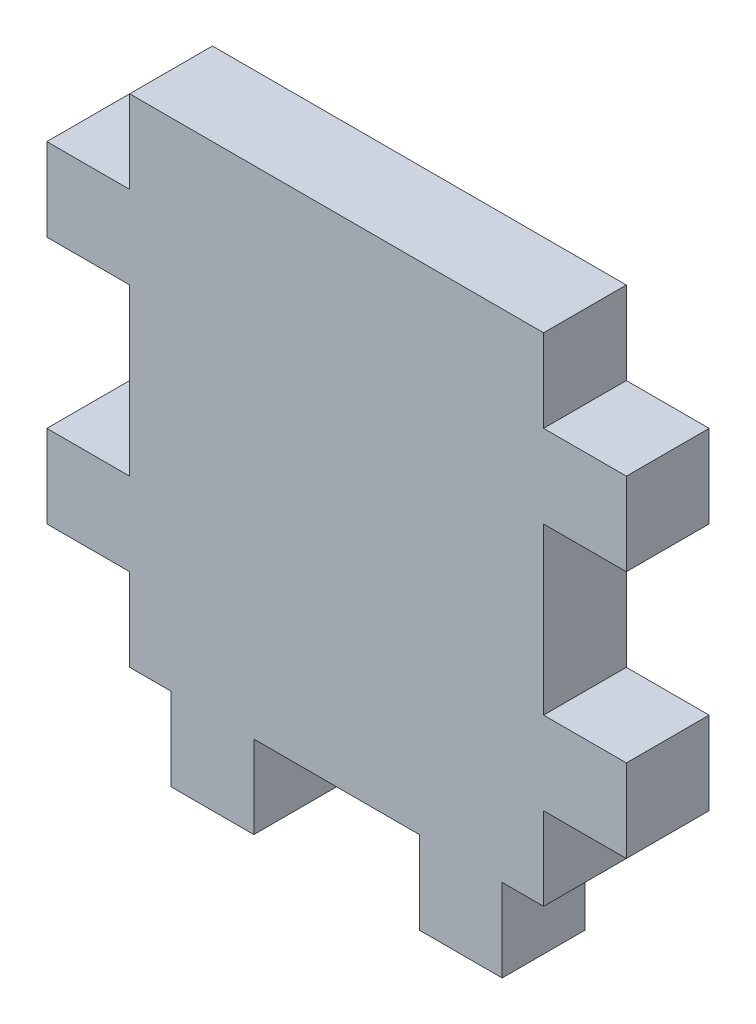
ISO-10303-21;
HEADER;
FILE_DESCRIPTION(('STEP AP214'),'2;1');
FILE_NAME('part.step','',(''),(''),'','','');
FILE_SCHEMA(('AUTOMOTIVE_DESIGN { 1 0 10303 214 1 1 1 1 }'));
ENDSEC;
DATA;
#1=APPLICATION_CONTEXT('core data for automotive mechanical design processes');
#2=APPLICATION_PROTOCOL_DEFINITION('international standard','automotive_design',2000,#1);
#3=PRODUCT_CONTEXT('',#1,'mechanical');
#4=PRODUCT('Part','Part','',(#3));
#5=PRODUCT_RELATED_PRODUCT_CATEGORY('part','',(#4));
#6=PRODUCT_DEFINITION_FORMATION('','',#4);
#7=PRODUCT_DEFINITION_CONTEXT('part definition',#1,'design');
#8=PRODUCT_DEFINITION('design','',#6,#7);
#9=PRODUCT_DEFINITION_SHAPE('','',#8);
#10=(LENGTH_UNIT() NAMED_UNIT(*) SI_UNIT(.MILLI.,.METRE.));
#11=(NAMED_UNIT(*) PLANE_ANGLE_UNIT() SI_UNIT($,.RADIAN.));
#12=(NAMED_UNIT(*) SI_UNIT($,.STERADIAN.) SOLID_ANGLE_UNIT());
#13=UNCERTAINTY_MEASURE_WITH_UNIT(LENGTH_MEASURE(1.E-05),#10,'distance_accuracy_value','');
#14=(GEOMETRIC_REPRESENTATION_CONTEXT(3) GLOBAL_UNCERTAINTY_ASSIGNED_CONTEXT((#13)) GLOBAL_UNIT_ASSIGNED_CONTEXT((#10,
#11,#12)) REPRESENTATION_CONTEXT('',''));
#15=CARTESIAN_POINT('',(0.,0.,0.));
#16=DIRECTION('',(0.,0.,1.));
#17=DIRECTION('',(1.,0.,0.));
#18=AXIS2_PLACEMENT_3D('',#15,#16,#17);
#19=CARTESIAN_POINT('',(5.,0.,5.));
#20=DIRECTION('',(0.,1.,0.));
#21=DIRECTION('',(-1.,0.,0.));
#22=AXIS2_PLACEMENT_3D('',#19,#20,#21);
#23=PLANE('',#22);
#24=DIRECTION('',(1.,0.,0.));
#25=VECTOR('',#24,1.);
#26=CARTESIAN_POINT('',(5.,0.,0.));
#27=LINE('',#26,#25);
#28=CARTESIAN_POINT('',(0.,0.,0.));
#29=VERTEX_POINT('',#28);
#30=CARTESIAN_POINT('',(5.,0.,0.));
#31=VERTEX_POINT('',#30);
#32=EDGE_CURVE('E252',#29,#31,#27,.T.);
#33=ORIENTED_EDGE('',*,*,#32,.T.);
#34=DIRECTION('',(0.,0.,-1.));
#35=VECTOR('',#34,1.);
#36=CARTESIAN_POINT('',(5.,0.,5.));
#37=LINE('',#36,#35);
#38=CARTESIAN_POINT('',(5.,0.,5.));
#39=VERTEX_POINT('',#38);
#40=EDGE_CURVE('E11',#39,#31,#37,.T.);
#41=ORIENTED_EDGE('',*,*,#40,.F.);
#42=DIRECTION('',(1.,0.,0.));
#43=VECTOR('',#42,1.);
#44=CARTESIAN_POINT('',(5.,0.,5.));
#45=LINE('',#44,#43);
#46=CARTESIAN_POINT('',(0.,0.,5.));
#47=VERTEX_POINT('',#46);
#48=EDGE_CURVE('E306',#47,#39,#45,.T.);
#49=ORIENTED_EDGE('',*,*,#48,.F.);
#50=DIRECTION('',(0.,0.,-1.));
#51=VECTOR('',#50,1.);
#52=CARTESIAN_POINT('',(0.,0.,5.));
#53=LINE('',#52,#51);
#54=EDGE_CURVE('E248',#47,#29,#53,.T.);
#55=ORIENTED_EDGE('',*,*,#54,.T.);
#56=EDGE_LOOP('',(#33,#41,#49,#55));
#57=FACE_BOUND('',#56,.T.);
#58=ADVANCED_FACE('F36',(#57),#23,.F.);
#59=CARTESIAN_POINT('',(5.,5.,5.));
#60=DIRECTION('',(-1.,0.,0.));
#61=DIRECTION('',(0.,-1.,0.));
#62=AXIS2_PLACEMENT_3D('',#59,#60,#61);
#63=PLANE('',#62);
#64=DIRECTION('',(0.,1.,0.));
#65=VECTOR('',#64,1.);
#66=CARTESIAN_POINT('',(5.,5.,0.));
#67=LINE('',#66,#65);
#68=CARTESIAN_POINT('',(5.,5.,0.));
#69=VERTEX_POINT('',#68);
#70=EDGE_CURVE('E255',#31,#69,#67,.T.);
#71=ORIENTED_EDGE('',*,*,#70,.T.);
#72=DIRECTION('',(0.,0.,-1.));
#73=VECTOR('',#72,1.);
#74=CARTESIAN_POINT('',(5.,5.,5.));
#75=LINE('',#74,#73);
#76=CARTESIAN_POINT('',(5.,5.,5.));
#77=VERTEX_POINT('',#76);
#78=EDGE_CURVE('E44',#77,#69,#75,.T.);
#79=ORIENTED_EDGE('',*,*,#78,.F.);
#80=DIRECTION('',(0.,1.,0.));
#81=VECTOR('',#80,1.);
#82=CARTESIAN_POINT('',(5.,5.,5.));
#83=LINE('',#82,#81);
#84=EDGE_CURVE('E155',#39,#77,#83,.T.);
#85=ORIENTED_EDGE('',*,*,#84,.F.);
#86=ORIENTED_EDGE('',*,*,#40,.T.);
#87=EDGE_LOOP('',(#71,#79,#85,#86));
#88=FACE_BOUND('',#87,.T.);
#89=ADVANCED_FACE('F464',(#88),#63,.F.);
#90=CARTESIAN_POINT('',(15.,5.,5.));
#91=DIRECTION('',(0.,1.,0.));
#92=DIRECTION('',(-1.,0.,0.));
#93=AXIS2_PLACEMENT_3D('',#90,#91,#92);
#94=PLANE('',#93);
#95=DIRECTION('',(1.,0.,0.));
#96=VECTOR('',#95,1.);
#97=CARTESIAN_POINT('',(15.,5.,0.));
#98=LINE('',#97,#96);
#99=CARTESIAN_POINT('',(15.,5.,0.));
#100=VERTEX_POINT('',#99);
#101=EDGE_CURVE('E257',#69,#100,#98,.T.);
#102=ORIENTED_EDGE('',*,*,#101,.T.);
#103=DIRECTION('',(0.,0.,-1.));
#104=VECTOR('',#103,1.);
#105=CARTESIAN_POINT('',(15.,5.,5.));
#106=LINE('',#105,#104);
#107=CARTESIAN_POINT('',(15.,5.,5.));
#108=VERTEX_POINT('',#107);
#109=EDGE_CURVE('E373',#108,#100,#106,.T.);
#110=ORIENTED_EDGE('',*,*,#109,.F.);
#111=DIRECTION('',(1.,0.,0.));
#112=VECTOR('',#111,1.);
#113=CARTESIAN_POINT('',(15.,5.,5.));
#114=LINE('',#113,#112);
#115=EDGE_CURVE('E381',#77,#108,#114,.T.);
#116=ORIENTED_EDGE('',*,*,#115,.F.);
#117=ORIENTED_EDGE('',*,*,#78,.T.);
#118=EDGE_LOOP('',(#102,#110,#116,#117));
#119=FACE_BOUND('',#118,.T.);
#120=ADVANCED_FACE('F379',(#119),#94,.F.);
#121=CARTESIAN_POINT('',(15.,0.,5.));
#122=DIRECTION('',(1.,0.,0.));
#123=DIRECTION('',(0.,0.,-1.));
#124=AXIS2_PLACEMENT_3D('',#121,#122,#123);
#125=PLANE('',#124);
#126=DIRECTION('',(0.,-1.,0.));
#127=VECTOR('',#126,1.);
#128=CARTESIAN_POINT('',(15.,0.,0.));
#129=LINE('',#128,#127);
#130=CARTESIAN_POINT('',(15.,0.,0.));
#131=VERTEX_POINT('',#130);
#132=EDGE_CURVE('E259',#100,#131,#129,.T.);
#133=ORIENTED_EDGE('',*,*,#132,.T.);
#134=DIRECTION('',(0.,0.,-1.));
#135=VECTOR('',#134,1.);
#136=CARTESIAN_POINT('',(15.,0.,5.));
#137=LINE('',#136,#135);
#138=CARTESIAN_POINT('',(15.,0.,5.));
#139=VERTEX_POINT('',#138);
#140=EDGE_CURVE('E370',#139,#131,#137,.T.);
#141=ORIENTED_EDGE('',*,*,#140,.F.);
#142=DIRECTION('',(0.,-1.,0.));
#143=VECTOR('',#142,1.);
#144=CARTESIAN_POINT('',(15.,0.,5.));
#145=LINE('',#144,#143);
#146=EDGE_CURVE('E399',#108,#139,#145,.T.);
#147=ORIENTED_EDGE('',*,*,#146,.F.);
#148=ORIENTED_EDGE('',*,*,#109,.T.);
#149=EDGE_LOOP('',(#133,#141,#147,#148));
#150=FACE_BOUND('',#149,.T.);
#151=ADVANCED_FACE('F390',(#150),#125,.F.);
#152=CARTESIAN_POINT('',(20.,0.,5.));
#153=DIRECTION('',(0.,1.,0.));
#154=DIRECTION('',(-1.,0.,0.));
#155=AXIS2_PLACEMENT_3D('',#152,#153,#154);
#156=PLANE('',#155);
#157=DIRECTION('',(1.,0.,0.));
#158=VECTOR('',#157,1.);
#159=CARTESIAN_POINT('',(20.,0.,0.));
#160=LINE('',#159,#158);
#161=CARTESIAN_POINT('',(20.,0.,0.));
#162=VERTEX_POINT('',#161);
#163=EDGE_CURVE('E261',#131,#162,#160,.T.);
#164=ORIENTED_EDGE('',*,*,#163,.T.);
#165=DIRECTION('',(0.,0.,-1.));
#166=VECTOR('',#165,1.);
#167=CARTESIAN_POINT('',(20.,0.,5.));
#168=LINE('',#167,#166);
#169=CARTESIAN_POINT('',(20.,0.,5.));
#170=VERTEX_POINT('',#169);
#171=EDGE_CURVE('E367',#170,#162,#168,.T.);
#172=ORIENTED_EDGE('',*,*,#171,.F.);
#173=DIRECTION('',(1.,0.,0.));
#174=VECTOR('',#173,1.);
#175=CARTESIAN_POINT('',(20.,0.,5.));
#176=LINE('',#175,#174);
#177=EDGE_CURVE('E396',#139,#170,#176,.T.);
#178=ORIENTED_EDGE('',*,*,#177,.F.);
#179=ORIENTED_EDGE('',*,*,#140,.T.);
#180=EDGE_LOOP('',(#164,#172,#178,#179));
#181=FACE_BOUND('',#180,.T.);
#182=ADVANCED_FACE('F394',(#181),#156,.F.);
#183=CARTESIAN_POINT('',(20.,5.,5.));
#184=DIRECTION('',(-1.,0.,0.));
#185=DIRECTION('',(0.,-1.,0.));
#186=AXIS2_PLACEMENT_3D('',#183,#184,#185);
#187=PLANE('',#186);
#188=DIRECTION('',(0.,1.,0.));
#189=VECTOR('',#188,1.);
#190=CARTESIAN_POINT('',(20.,5.,0.));
#191=LINE('',#190,#189);
#192=CARTESIAN_POINT('',(20.,5.,0.));
#193=VERTEX_POINT('',#192);
#194=EDGE_CURVE('E263',#162,#193,#191,.T.);
#195=ORIENTED_EDGE('',*,*,#194,.T.);
#196=DIRECTION('',(0.,0.,-1.));
#197=VECTOR('',#196,1.);
#198=CARTESIAN_POINT('',(20.,5.,5.));
#199=LINE('',#198,#197);
#200=CARTESIAN_POINT('',(20.,5.,5.));
#201=VERTEX_POINT('',#200);
#202=EDGE_CURVE('E364',#201,#193,#199,.T.);
#203=ORIENTED_EDGE('',*,*,#202,.F.);
#204=DIRECTION('',(0.,1.,0.));
#205=VECTOR('',#204,1.);
#206=CARTESIAN_POINT('',(20.,5.,5.));
#207=LINE('',#206,#205);
#208=EDGE_CURVE('E398',#170,#201,#207,.T.);
#209=ORIENTED_EDGE('',*,*,#208,.F.);
#210=ORIENTED_EDGE('',*,*,#171,.T.);
#211=EDGE_LOOP('',(#195,#203,#209,#210));
#212=FACE_BOUND('',#211,.T.);
#213=ADVANCED_FACE('F477',(#212),#187,.F.);
#214=CARTESIAN_POINT('',(22.5,5.,5.));
#215=DIRECTION('',(0.,1.,0.));
#216=DIRECTION('',(-1.,0.,0.));
#217=AXIS2_PLACEMENT_3D('',#214,#215,#216);
#218=PLANE('',#217);
#219=DIRECTION('',(1.,0.,0.));
#220=VECTOR('',#219,1.);
#221=CARTESIAN_POINT('',(22.5,5.,0.));
#222=LINE('',#221,#220);
#223=CARTESIAN_POINT('',(22.5,5.,0.));
#224=VERTEX_POINT('',#223);
#225=EDGE_CURVE('E265',#193,#224,#222,.T.);
#226=ORIENTED_EDGE('',*,*,#225,.T.);
#227=DIRECTION('',(0.,0.,-1.));
#228=VECTOR('',#227,1.);
#229=CARTESIAN_POINT('',(22.5,5.,5.));
#230=LINE('',#229,#228);
#231=CARTESIAN_POINT('',(22.5,5.,5.));
#232=VERTEX_POINT('',#231);
#233=EDGE_CURVE('E361',#232,#224,#230,.T.);
#234=ORIENTED_EDGE('',*,*,#233,.F.);
#235=DIRECTION('',(1.,0.,0.));
#236=VECTOR('',#235,1.);
#237=CARTESIAN_POINT('',(22.5,5.,5.));
#238=LINE('',#237,#236);
#239=EDGE_CURVE('E401',#201,#232,#238,.T.);
#240=ORIENTED_EDGE('',*,*,#239,.F.);
#241=ORIENTED_EDGE('',*,*,#202,.T.);
#242=EDGE_LOOP('',(#226,#234,#240,#241));
#243=FACE_BOUND('',#242,.T.);
#244=ADVANCED_FACE('F480',(#243),#218,.F.);
#245=CARTESIAN_POINT('',(22.5,10.0002749662121,5.));
#246=DIRECTION('',(-1.,0.,0.));
#247=DIRECTION('',(0.,-1.,0.));
#248=AXIS2_PLACEMENT_3D('',#245,#246,#247);
#249=PLANE('',#248);
#250=DIRECTION('',(0.,1.,0.));
#251=VECTOR('',#250,1.);
#252=CARTESIAN_POINT('',(22.5,10.0002749662121,0.));
#253=LINE('',#252,#251);
#254=CARTESIAN_POINT('',(22.5,10.0002749662121,0.));
#255=VERTEX_POINT('',#254);
#256=EDGE_CURVE('E267',#224,#255,#253,.T.);
#257=ORIENTED_EDGE('',*,*,#256,.T.);
#258=DIRECTION('',(0.,0.,-1.));
#259=VECTOR('',#258,1.);
#260=CARTESIAN_POINT('',(22.5,10.0002749662121,5.));
#261=LINE('',#260,#259);
#262=CARTESIAN_POINT('',(22.5,10.0002749662121,5.));
#263=VERTEX_POINT('',#262);
#264=EDGE_CURVE('E358',#263,#255,#261,.T.);
#265=ORIENTED_EDGE('',*,*,#264,.F.);
#266=DIRECTION('',(0.,1.,0.));
#267=VECTOR('',#266,1.);
#268=CARTESIAN_POINT('',(22.5,10.0002749662121,5.));
#269=LINE('',#268,#267);
#270=EDGE_CURVE('E407',#232,#263,#269,.T.);
#271=ORIENTED_EDGE('',*,*,#270,.F.);
#272=ORIENTED_EDGE('',*,*,#233,.T.);
#273=EDGE_LOOP('',(#257,#265,#271,#272));
#274=FACE_BOUND('',#273,.T.);
#275=ADVANCED_FACE('F484',(#274),#249,.F.);
#276=CARTESIAN_POINT('',(27.5,10.0002749662121,5.));
#277=DIRECTION('',(0.,1.,0.));
#278=DIRECTION('',(0.,0.,1.));
#279=AXIS2_PLACEMENT_3D('',#276,#277,#278);
#280=PLANE('',#279);
#281=DIRECTION('',(1.,0.,0.));
#282=VECTOR('',#281,1.);
#283=CARTESIAN_POINT('',(27.5,10.0002749662121,0.));
#284=LINE('',#283,#282);
#285=CARTESIAN_POINT('',(27.5,10.0002749662121,0.));
#286=VERTEX_POINT('',#285);
#287=EDGE_CURVE('E269',#255,#286,#284,.T.);
#288=ORIENTED_EDGE('',*,*,#287,.T.);
#289=DIRECTION('',(0.,0.,-1.));
#290=VECTOR('',#289,1.);
#291=CARTESIAN_POINT('',(27.5,10.0002749662121,5.));
#292=LINE('',#291,#290);
#293=CARTESIAN_POINT('',(27.5,10.0002749662121,5.));
#294=VERTEX_POINT('',#293);
#295=EDGE_CURVE('E355',#294,#286,#292,.T.);
#296=ORIENTED_EDGE('',*,*,#295,.F.);
#297=DIRECTION('',(1.,0.,0.));
#298=VECTOR('',#297,1.);
#299=CARTESIAN_POINT('',(27.5,10.0002749662121,5.));
#300=LINE('',#299,#298);
#301=EDGE_CURVE('E409',#263,#294,#300,.T.);
#302=ORIENTED_EDGE('',*,*,#301,.F.);
#303=ORIENTED_EDGE('',*,*,#264,.T.);
#304=EDGE_LOOP('',(#288,#296,#302,#303));
#305=FACE_BOUND('',#304,.T.);
#306=ADVANCED_FACE('F488',(#305),#280,.F.);
#307=CARTESIAN_POINT('',(27.5,15.0002749662121,5.));
#308=DIRECTION('',(-1.,0.,0.));
#309=DIRECTION('',(0.,-1.,0.));
#310=AXIS2_PLACEMENT_3D('',#307,#308,#309);
#311=PLANE('',#310);
#312=DIRECTION('',(0.,1.,0.));
#313=VECTOR('',#312,1.);
#314=CARTESIAN_POINT('',(27.5,15.0002749662121,0.));
#315=LINE('',#314,#313);
#316=CARTESIAN_POINT('',(27.5,15.0002749662121,0.));
#317=VERTEX_POINT('',#316);
#318=EDGE_CURVE('E271',#286,#317,#315,.T.);
#319=ORIENTED_EDGE('',*,*,#318,.T.);
#320=DIRECTION('',(0.,0.,-1.));
#321=VECTOR('',#320,1.);
#322=CARTESIAN_POINT('',(27.5,15.0002749662121,5.));
#323=LINE('',#322,#321);
#324=CARTESIAN_POINT('',(27.5,15.0002749662121,5.));
#325=VERTEX_POINT('',#324);
#326=EDGE_CURVE('E352',#325,#317,#323,.T.);
#327=ORIENTED_EDGE('',*,*,#326,.F.);
#328=DIRECTION('',(0.,1.,0.));
#329=VECTOR('',#328,1.);
#330=CARTESIAN_POINT('',(27.5,15.0002749662121,5.));
#331=LINE('',#330,#329);
#332=EDGE_CURVE('E411',#294,#325,#331,.T.);
#333=ORIENTED_EDGE('',*,*,#332,.F.);
#334=ORIENTED_EDGE('',*,*,#295,.T.);
#335=EDGE_LOOP('',(#319,#327,#333,#334));
#336=FACE_BOUND('',#335,.T.);
#337=ADVANCED_FACE('F492',(#336),#311,.F.);
#338=CARTESIAN_POINT('',(22.5,15.0002749662121,5.));
#339=DIRECTION('',(0.,-1.,0.));
#340=DIRECTION('',(0.,0.,-1.));
#341=AXIS2_PLACEMENT_3D('',#338,#339,#340);
#342=PLANE('',#341);
#343=DIRECTION('',(-1.,0.,0.));
#344=VECTOR('',#343,1.);
#345=CARTESIAN_POINT('',(22.5,15.0002749662121,0.));
#346=LINE('',#345,#344);
#347=CARTESIAN_POINT('',(22.5,15.0002749662121,0.));
#348=VERTEX_POINT('',#347);
#349=EDGE_CURVE('E273',#317,#348,#346,.T.);
#350=ORIENTED_EDGE('',*,*,#349,.T.);
#351=DIRECTION('',(0.,0.,-1.));
#352=VECTOR('',#351,1.);
#353=CARTESIAN_POINT('',(22.5,15.0002749662121,5.));
#354=LINE('',#353,#352);
#355=CARTESIAN_POINT('',(22.5,15.0002749662121,5.));
#356=VERTEX_POINT('',#355);
#357=EDGE_CURVE('E349',#356,#348,#354,.T.);
#358=ORIENTED_EDGE('',*,*,#357,.F.);
#359=DIRECTION('',(-1.,0.,0.));
#360=VECTOR('',#359,1.);
#361=CARTESIAN_POINT('',(22.5,15.0002749662121,5.));
#362=LINE('',#361,#360);
#363=EDGE_CURVE('E413',#325,#356,#362,.T.);
#364=ORIENTED_EDGE('',*,*,#363,.F.);
#365=ORIENTED_EDGE('',*,*,#326,.T.);
#366=EDGE_LOOP('',(#350,#358,#364,#365));
#367=FACE_BOUND('',#366,.T.);
#368=ADVANCED_FACE('F496',(#367),#342,.F.);
#369=CARTESIAN_POINT('',(22.5,25.0002749662121,5.));
#370=DIRECTION('',(-1.,0.,0.));
#371=DIRECTION('',(0.,-1.,0.));
#372=AXIS2_PLACEMENT_3D('',#369,#370,#371);
#373=PLANE('',#372);
#374=DIRECTION('',(0.,1.,0.));
#375=VECTOR('',#374,1.);
#376=CARTESIAN_POINT('',(22.5,25.0002749662121,0.));
#377=LINE('',#376,#375);
#378=CARTESIAN_POINT('',(22.5,25.0002749662121,0.));
#379=VERTEX_POINT('',#378);
#380=EDGE_CURVE('E275',#348,#379,#377,.T.);
#381=ORIENTED_EDGE('',*,*,#380,.T.);
#382=DIRECTION('',(0.,0.,-1.));
#383=VECTOR('',#382,1.);
#384=CARTESIAN_POINT('',(22.5,25.0002749662121,5.));
#385=LINE('',#384,#383);
#386=CARTESIAN_POINT('',(22.5,25.0002749662121,5.));
#387=VERTEX_POINT('',#386);
#388=EDGE_CURVE('E346',#387,#379,#385,.T.);
#389=ORIENTED_EDGE('',*,*,#388,.F.);
#390=DIRECTION('',(0.,1.,0.));
#391=VECTOR('',#390,1.);
#392=CARTESIAN_POINT('',(22.5,25.0002749662121,5.));
#393=LINE('',#392,#391);
#394=EDGE_CURVE('E415',#356,#387,#393,.T.);
#395=ORIENTED_EDGE('',*,*,#394,.F.);
#396=ORIENTED_EDGE('',*,*,#357,.T.);
#397=EDGE_LOOP('',(#381,#389,#395,#396));
#398=FACE_BOUND('',#397,.T.);
#399=ADVANCED_FACE('F500',(#398),#373,.F.);
#400=CARTESIAN_POINT('',(27.5,25.0002749662121,5.));
#401=DIRECTION('',(0.,1.,0.));
#402=DIRECTION('',(0.,0.,1.));
#403=AXIS2_PLACEMENT_3D('',#400,#401,#402);
#404=PLANE('',#403);
#405=DIRECTION('',(1.,0.,0.));
#406=VECTOR('',#405,1.);
#407=CARTESIAN_POINT('',(27.5,25.0002749662121,0.));
#408=LINE('',#407,#406);
#409=CARTESIAN_POINT('',(27.5,25.0002749662121,0.));
#410=VERTEX_POINT('',#409);
#411=EDGE_CURVE('E277',#379,#410,#408,.T.);
#412=ORIENTED_EDGE('',*,*,#411,.T.);
#413=DIRECTION('',(0.,0.,-1.));
#414=VECTOR('',#413,1.);
#415=CARTESIAN_POINT('',(27.5,25.0002749662121,5.));
#416=LINE('',#415,#414);
#417=CARTESIAN_POINT('',(27.5,25.0002749662121,5.));
#418=VERTEX_POINT('',#417);
#419=EDGE_CURVE('E343',#418,#410,#416,.T.);
#420=ORIENTED_EDGE('',*,*,#419,.F.);
#421=DIRECTION('',(1.,0.,0.));
#422=VECTOR('',#421,1.);
#423=CARTESIAN_POINT('',(27.5,25.0002749662121,5.));
#424=LINE('',#423,#422);
#425=EDGE_CURVE('E417',#387,#418,#424,.T.);
#426=ORIENTED_EDGE('',*,*,#425,.F.);
#427=ORIENTED_EDGE('',*,*,#388,.T.);
#428=EDGE_LOOP('',(#412,#420,#426,#427));
#429=FACE_BOUND('',#428,.T.);
#430=ADVANCED_FACE('F504',(#429),#404,.F.);
#431=CARTESIAN_POINT('',(27.5,30.0002749662121,5.));
#432=DIRECTION('',(-1.,0.,0.));
#433=DIRECTION('',(0.,0.,1.));
#434=AXIS2_PLACEMENT_3D('',#431,#432,#433);
#435=PLANE('',#434);
#436=DIRECTION('',(0.,1.,0.));
#437=VECTOR('',#436,1.);
#438=CARTESIAN_POINT('',(27.5,30.0002749662121,0.));
#439=LINE('',#438,#437);
#440=CARTESIAN_POINT('',(27.5,30.0002749662121,0.));
#441=VERTEX_POINT('',#440);
#442=EDGE_CURVE('E279',#410,#441,#439,.T.);
#443=ORIENTED_EDGE('',*,*,#442,.T.);
#444=DIRECTION('',(0.,0.,-1.));
#445=VECTOR('',#444,1.);
#446=CARTESIAN_POINT('',(27.5,30.0002749662121,5.));
#447=LINE('',#446,#445);
#448=CARTESIAN_POINT('',(27.5,30.0002749662121,5.));
#449=VERTEX_POINT('',#448);
#450=EDGE_CURVE('E340',#449,#441,#447,.T.);
#451=ORIENTED_EDGE('',*,*,#450,.F.);
#452=DIRECTION('',(0.,1.,0.));
#453=VECTOR('',#452,1.);
#454=CARTESIAN_POINT('',(27.5,30.0002749662121,5.));
#455=LINE('',#454,#453);
#456=EDGE_CURVE('E419',#418,#449,#455,.T.);
#457=ORIENTED_EDGE('',*,*,#456,.F.);
#458=ORIENTED_EDGE('',*,*,#419,.T.);
#459=EDGE_LOOP('',(#443,#451,#457,#458));
#460=FACE_BOUND('',#459,.T.);
#461=ADVANCED_FACE('F508',(#460),#435,.F.);
#462=CARTESIAN_POINT('',(22.5,30.0002749662121,5.));
#463=DIRECTION('',(0.,-1.,0.));
#464=DIRECTION('',(0.,0.,-1.));
#465=AXIS2_PLACEMENT_3D('',#462,#463,#464);
#466=PLANE('',#465);
#467=DIRECTION('',(-1.,0.,0.));
#468=VECTOR('',#467,1.);
#469=CARTESIAN_POINT('',(22.5,30.0002749662121,0.));
#470=LINE('',#469,#468);
#471=CARTESIAN_POINT('',(22.5,30.0002749662121,0.));
#472=VERTEX_POINT('',#471);
#473=EDGE_CURVE('E281',#441,#472,#470,.T.);
#474=ORIENTED_EDGE('',*,*,#473,.T.);
#475=DIRECTION('',(0.,0.,-1.));
#476=VECTOR('',#475,1.);
#477=CARTESIAN_POINT('',(22.5,30.0002749662121,5.));
#478=LINE('',#477,#476);
#479=CARTESIAN_POINT('',(22.5,30.0002749662121,5.));
#480=VERTEX_POINT('',#479);
#481=EDGE_CURVE('E337',#480,#472,#478,.T.);
#482=ORIENTED_EDGE('',*,*,#481,.F.);
#483=DIRECTION('',(-1.,0.,0.));
#484=VECTOR('',#483,1.);
#485=CARTESIAN_POINT('',(22.5,30.0002749662121,5.));
#486=LINE('',#485,#484);
#487=EDGE_CURVE('E421',#449,#480,#486,.T.);
#488=ORIENTED_EDGE('',*,*,#487,.F.);
#489=ORIENTED_EDGE('',*,*,#450,.T.);
#490=EDGE_LOOP('',(#474,#482,#488,#489));
#491=FACE_BOUND('',#490,.T.);
#492=ADVANCED_FACE('F512',(#491),#466,.F.);
#493=CARTESIAN_POINT('',(22.5,35.,5.));
#494=DIRECTION('',(-1.,0.,0.));
#495=DIRECTION('',(0.,-1.,0.));
#496=AXIS2_PLACEMENT_3D('',#493,#494,#495);
#497=PLANE('',#496);
#498=DIRECTION('',(0.,1.,0.));
#499=VECTOR('',#498,1.);
#500=CARTESIAN_POINT('',(22.5,35.,0.));
#501=LINE('',#500,#499);
#502=CARTESIAN_POINT('',(22.5,35.,0.));
#503=VERTEX_POINT('',#502);
#504=EDGE_CURVE('E283',#472,#503,#501,.T.);
#505=ORIENTED_EDGE('',*,*,#504,.T.);
#506=DIRECTION('',(0.,0.,-1.));
#507=VECTOR('',#506,1.);
#508=CARTESIAN_POINT('',(22.5,35.,5.));
#509=LINE('',#508,#507);
#510=CARTESIAN_POINT('',(22.5,35.,5.));
#511=VERTEX_POINT('',#510);
#512=EDGE_CURVE('E334',#511,#503,#509,.T.);
#513=ORIENTED_EDGE('',*,*,#512,.F.);
#514=DIRECTION('',(0.,1.,0.));
#515=VECTOR('',#514,1.);
#516=CARTESIAN_POINT('',(22.5,35.,5.));
#517=LINE('',#516,#515);
#518=EDGE_CURVE('E423',#480,#511,#517,.T.);
#519=ORIENTED_EDGE('',*,*,#518,.F.);
#520=ORIENTED_EDGE('',*,*,#481,.T.);
#521=EDGE_LOOP('',(#505,#513,#519,#520));
#522=FACE_BOUND('',#521,.T.);
#523=ADVANCED_FACE('F516',(#522),#497,.F.);
#524=CARTESIAN_POINT('',(-2.5,35.,5.));
#525=DIRECTION('',(0.,-1.,0.));
#526=DIRECTION('',(0.,0.,-1.));
#527=AXIS2_PLACEMENT_3D('',#524,#525,#526);
#528=PLANE('',#527);
#529=DIRECTION('',(-1.,0.,0.));
#530=VECTOR('',#529,1.);
#531=CARTESIAN_POINT('',(-2.5,35.,0.));
#532=LINE('',#531,#530);
#533=CARTESIAN_POINT('',(-2.5,35.,0.));
#534=VERTEX_POINT('',#533);
#535=EDGE_CURVE('E285',#503,#534,#532,.T.);
#536=ORIENTED_EDGE('',*,*,#535,.T.);
#537=DIRECTION('',(0.,0.,-1.));
#538=VECTOR('',#537,1.);
#539=CARTESIAN_POINT('',(-2.5,35.,5.));
#540=LINE('',#539,#538);
#541=CARTESIAN_POINT('',(-2.5,35.,5.));
#542=VERTEX_POINT('',#541);
#543=EDGE_CURVE('E331',#542,#534,#540,.T.);
#544=ORIENTED_EDGE('',*,*,#543,.F.);
#545=DIRECTION('',(-1.,0.,0.));
#546=VECTOR('',#545,1.);
#547=CARTESIAN_POINT('',(-2.5,35.,5.));
#548=LINE('',#547,#546);
#549=EDGE_CURVE('E425',#511,#542,#548,.T.);
#550=ORIENTED_EDGE('',*,*,#549,.F.);
#551=ORIENTED_EDGE('',*,*,#512,.T.);
#552=EDGE_LOOP('',(#536,#544,#550,#551));
#553=FACE_BOUND('',#552,.T.);
#554=ADVANCED_FACE('F520',(#553),#528,.F.);
#555=CARTESIAN_POINT('',(-2.5,30.0002749662121,5.));
#556=DIRECTION('',(1.,0.,0.));
#557=DIRECTION('',(0.,0.,-1.));
#558=AXIS2_PLACEMENT_3D('',#555,#556,#557);
#559=PLANE('',#558);
#560=DIRECTION('',(0.,-1.,0.));
#561=VECTOR('',#560,1.);
#562=CARTESIAN_POINT('',(-2.5,30.0002749662121,0.));
#563=LINE('',#562,#561);
#564=CARTESIAN_POINT('',(-2.5,30.0002749662121,0.));
#565=VERTEX_POINT('',#564);
#566=EDGE_CURVE('E287',#534,#565,#563,.T.);
#567=ORIENTED_EDGE('',*,*,#566,.T.);
#568=DIRECTION('',(0.,0.,-1.));
#569=VECTOR('',#568,1.);
#570=CARTESIAN_POINT('',(-2.5,30.0002749662121,5.));
#571=LINE('',#570,#569);
#572=CARTESIAN_POINT('',(-2.5,30.0002749662121,5.));
#573=VERTEX_POINT('',#572);
#574=EDGE_CURVE('E328',#573,#565,#571,.T.);
#575=ORIENTED_EDGE('',*,*,#574,.F.);
#576=DIRECTION('',(0.,-1.,0.));
#577=VECTOR('',#576,1.);
#578=CARTESIAN_POINT('',(-2.5,30.0002749662121,5.));
#579=LINE('',#578,#577);
#580=EDGE_CURVE('E427',#542,#573,#579,.T.);
#581=ORIENTED_EDGE('',*,*,#580,.F.);
#582=ORIENTED_EDGE('',*,*,#543,.T.);
#583=EDGE_LOOP('',(#567,#575,#581,#582));
#584=FACE_BOUND('',#583,.T.);
#585=ADVANCED_FACE('F524',(#584),#559,.F.);
#586=CARTESIAN_POINT('',(-7.5,30.0002749662121,5.));
#587=DIRECTION('',(0.,-1.,0.));
#588=DIRECTION('',(0.,0.,-1.));
#589=AXIS2_PLACEMENT_3D('',#586,#587,#588);
#590=PLANE('',#589);
#591=DIRECTION('',(-1.,0.,0.));
#592=VECTOR('',#591,1.);
#593=CARTESIAN_POINT('',(-7.5,30.0002749662121,0.));
#594=LINE('',#593,#592);
#595=CARTESIAN_POINT('',(-7.5,30.0002749662121,0.));
#596=VERTEX_POINT('',#595);
#597=EDGE_CURVE('E289',#565,#596,#594,.T.);
#598=ORIENTED_EDGE('',*,*,#597,.T.);
#599=DIRECTION('',(0.,0.,-1.));
#600=VECTOR('',#599,1.);
#601=CARTESIAN_POINT('',(-7.5,30.0002749662121,5.));
#602=LINE('',#601,#600);
#603=CARTESIAN_POINT('',(-7.5,30.0002749662121,5.));
#604=VERTEX_POINT('',#603);
#605=EDGE_CURVE('E325',#604,#596,#602,.T.);
#606=ORIENTED_EDGE('',*,*,#605,.F.);
#607=DIRECTION('',(-1.,0.,0.));
#608=VECTOR('',#607,1.);
#609=CARTESIAN_POINT('',(-7.5,30.0002749662121,5.));
#610=LINE('',#609,#608);
#611=EDGE_CURVE('E429',#573,#604,#610,.T.);
#612=ORIENTED_EDGE('',*,*,#611,.F.);
#613=ORIENTED_EDGE('',*,*,#574,.T.);
#614=EDGE_LOOP('',(#598,#606,#612,#613));
#615=FACE_BOUND('',#614,.T.);
#616=ADVANCED_FACE('F528',(#615),#590,.F.);
#617=CARTESIAN_POINT('',(-7.5,25.0002749662121,5.));
#618=DIRECTION('',(1.,0.,0.));
#619=DIRECTION('',(0.,0.,-1.));
#620=AXIS2_PLACEMENT_3D('',#617,#618,#619);
#621=PLANE('',#620);
#622=DIRECTION('',(0.,-1.,0.));
#623=VECTOR('',#622,1.);
#624=CARTESIAN_POINT('',(-7.5,25.0002749662121,0.));
#625=LINE('',#624,#623);
#626=CARTESIAN_POINT('',(-7.5,25.0002749662121,0.));
#627=VERTEX_POINT('',#626);
#628=EDGE_CURVE('E291',#596,#627,#625,.T.);
#629=ORIENTED_EDGE('',*,*,#628,.T.);
#630=DIRECTION('',(0.,0.,-1.));
#631=VECTOR('',#630,1.);
#632=CARTESIAN_POINT('',(-7.5,25.0002749662121,5.));
#633=LINE('',#632,#631);
#634=CARTESIAN_POINT('',(-7.5,25.0002749662121,5.));
#635=VERTEX_POINT('',#634);
#636=EDGE_CURVE('E322',#635,#627,#633,.T.);
#637=ORIENTED_EDGE('',*,*,#636,.F.);
#638=DIRECTION('',(0.,-1.,0.));
#639=VECTOR('',#638,1.);
#640=CARTESIAN_POINT('',(-7.5,25.0002749662121,5.));
#641=LINE('',#640,#639);
#642=EDGE_CURVE('E431',#604,#635,#641,.T.);
#643=ORIENTED_EDGE('',*,*,#642,.F.);
#644=ORIENTED_EDGE('',*,*,#605,.T.);
#645=EDGE_LOOP('',(#629,#637,#643,#644));
#646=FACE_BOUND('',#645,.T.);
#647=ADVANCED_FACE('F532',(#646),#621,.F.);
#648=CARTESIAN_POINT('',(-2.5,25.0002749662121,5.));
#649=DIRECTION('',(0.,1.,0.));
#650=DIRECTION('',(-1.,0.,0.));
#651=AXIS2_PLACEMENT_3D('',#648,#649,#650);
#652=PLANE('',#651);
#653=DIRECTION('',(1.,0.,0.));
#654=VECTOR('',#653,1.);
#655=CARTESIAN_POINT('',(-2.5,25.0002749662121,0.));
#656=LINE('',#655,#654);
#657=CARTESIAN_POINT('',(-2.5,25.0002749662121,0.));
#658=VERTEX_POINT('',#657);
#659=EDGE_CURVE('E293',#627,#658,#656,.T.);
#660=ORIENTED_EDGE('',*,*,#659,.T.);
#661=DIRECTION('',(0.,0.,-1.));
#662=VECTOR('',#661,1.);
#663=CARTESIAN_POINT('',(-2.5,25.0002749662121,5.));
#664=LINE('',#663,#662);
#665=CARTESIAN_POINT('',(-2.5,25.0002749662121,5.));
#666=VERTEX_POINT('',#665);
#667=EDGE_CURVE('E319',#666,#658,#664,.T.);
#668=ORIENTED_EDGE('',*,*,#667,.F.);
#669=DIRECTION('',(1.,0.,0.));
#670=VECTOR('',#669,1.);
#671=CARTESIAN_POINT('',(-2.5,25.0002749662121,5.));
#672=LINE('',#671,#670);
#673=EDGE_CURVE('E433',#635,#666,#672,.T.);
#674=ORIENTED_EDGE('',*,*,#673,.F.);
#675=ORIENTED_EDGE('',*,*,#636,.T.);
#676=EDGE_LOOP('',(#660,#668,#674,#675));
#677=FACE_BOUND('',#676,.T.);
#678=ADVANCED_FACE('F536',(#677),#652,.F.);
#679=CARTESIAN_POINT('',(-2.5,15.0002749662121,5.));
#680=DIRECTION('',(1.,0.,0.));
#681=DIRECTION('',(0.,0.,-1.));
#682=AXIS2_PLACEMENT_3D('',#679,#680,#681);
#683=PLANE('',#682);
#684=DIRECTION('',(0.,-1.,0.));
#685=VECTOR('',#684,1.);
#686=CARTESIAN_POINT('',(-2.5,15.0002749662121,0.));
#687=LINE('',#686,#685);
#688=CARTESIAN_POINT('',(-2.5,15.0002749662121,0.));
#689=VERTEX_POINT('',#688);
#690=EDGE_CURVE('E295',#658,#689,#687,.T.);
#691=ORIENTED_EDGE('',*,*,#690,.T.);
#692=DIRECTION('',(0.,0.,-1.));
#693=VECTOR('',#692,1.);
#694=CARTESIAN_POINT('',(-2.5,15.0002749662121,5.));
#695=LINE('',#694,#693);
#696=CARTESIAN_POINT('',(-2.5,15.0002749662121,5.));
#697=VERTEX_POINT('',#696);
#698=EDGE_CURVE('E316',#697,#689,#695,.T.);
#699=ORIENTED_EDGE('',*,*,#698,.F.);
#700=DIRECTION('',(0.,-1.,0.));
#701=VECTOR('',#700,1.);
#702=CARTESIAN_POINT('',(-2.5,15.0002749662121,5.));
#703=LINE('',#702,#701);
#704=EDGE_CURVE('E435',#666,#697,#703,.T.);
#705=ORIENTED_EDGE('',*,*,#704,.F.);
#706=ORIENTED_EDGE('',*,*,#667,.T.);
#707=EDGE_LOOP('',(#691,#699,#705,#706));
#708=FACE_BOUND('',#707,.T.);
#709=ADVANCED_FACE('F540',(#708),#683,.F.);
#710=CARTESIAN_POINT('',(-7.5,15.0002749662121,5.));
#711=DIRECTION('',(0.,-1.,0.));
#712=DIRECTION('',(0.,0.,-1.));
#713=AXIS2_PLACEMENT_3D('',#710,#711,#712);
#714=PLANE('',#713);
#715=DIRECTION('',(-1.,0.,0.));
#716=VECTOR('',#715,1.);
#717=CARTESIAN_POINT('',(-7.5,15.0002749662121,0.));
#718=LINE('',#717,#716);
#719=CARTESIAN_POINT('',(-7.5,15.0002749662121,0.));
#720=VERTEX_POINT('',#719);
#721=EDGE_CURVE('E297',#689,#720,#718,.T.);
#722=ORIENTED_EDGE('',*,*,#721,.T.);
#723=DIRECTION('',(0.,0.,-1.));
#724=VECTOR('',#723,1.);
#725=CARTESIAN_POINT('',(-7.5,15.0002749662121,5.));
#726=LINE('',#725,#724);
#727=CARTESIAN_POINT('',(-7.5,15.0002749662121,5.));
#728=VERTEX_POINT('',#727);
#729=EDGE_CURVE('E313',#728,#720,#726,.T.);
#730=ORIENTED_EDGE('',*,*,#729,.F.);
#731=DIRECTION('',(-1.,0.,0.));
#732=VECTOR('',#731,1.);
#733=CARTESIAN_POINT('',(-7.5,15.0002749662121,5.));
#734=LINE('',#733,#732);
#735=EDGE_CURVE('E437',#697,#728,#734,.T.);
#736=ORIENTED_EDGE('',*,*,#735,.F.);
#737=ORIENTED_EDGE('',*,*,#698,.T.);
#738=EDGE_LOOP('',(#722,#730,#736,#737));
#739=FACE_BOUND('',#738,.T.);
#740=ADVANCED_FACE('F544',(#739),#714,.F.);
#741=CARTESIAN_POINT('',(-7.5,10.0002749662121,5.));
#742=DIRECTION('',(1.,0.,0.));
#743=DIRECTION('',(0.,0.,-1.));
#744=AXIS2_PLACEMENT_3D('',#741,#742,#743);
#745=PLANE('',#744);
#746=DIRECTION('',(0.,-1.,0.));
#747=VECTOR('',#746,1.);
#748=CARTESIAN_POINT('',(-7.5,10.0002749662121,0.));
#749=LINE('',#748,#747);
#750=CARTESIAN_POINT('',(-7.5,10.0002749662121,0.));
#751=VERTEX_POINT('',#750);
#752=EDGE_CURVE('E299',#720,#751,#749,.T.);
#753=ORIENTED_EDGE('',*,*,#752,.T.);
#754=DIRECTION('',(0.,0.,-1.));
#755=VECTOR('',#754,1.);
#756=CARTESIAN_POINT('',(-7.5,10.0002749662121,5.));
#757=LINE('',#756,#755);
#758=CARTESIAN_POINT('',(-7.5,10.0002749662121,5.));
#759=VERTEX_POINT('',#758);
#760=EDGE_CURVE('E310',#759,#751,#757,.T.);
#761=ORIENTED_EDGE('',*,*,#760,.F.);
#762=DIRECTION('',(0.,-1.,0.));
#763=VECTOR('',#762,1.);
#764=CARTESIAN_POINT('',(-7.5,10.0002749662121,5.));
#765=LINE('',#764,#763);
#766=EDGE_CURVE('E439',#728,#759,#765,.T.);
#767=ORIENTED_EDGE('',*,*,#766,.F.);
#768=ORIENTED_EDGE('',*,*,#729,.T.);
#769=EDGE_LOOP('',(#753,#761,#767,#768));
#770=FACE_BOUND('',#769,.T.);
#771=ADVANCED_FACE('F445',(#770),#745,.F.);
#772=CARTESIAN_POINT('',(-2.5,10.0002749662121,5.));
#773=DIRECTION('',(0.,1.,0.));
#774=DIRECTION('',(0.,0.,1.));
#775=AXIS2_PLACEMENT_3D('',#772,#773,#774);
#776=PLANE('',#775);
#777=DIRECTION('',(1.,0.,0.));
#778=VECTOR('',#777,1.);
#779=CARTESIAN_POINT('',(-2.5,10.0002749662121,0.));
#780=LINE('',#779,#778);
#781=CARTESIAN_POINT('',(-2.5,10.0002749662121,0.));
#782=VERTEX_POINT('',#781);
#783=EDGE_CURVE('E301',#751,#782,#780,.T.);
#784=ORIENTED_EDGE('',*,*,#783,.T.);
#785=DIRECTION('',(0.,0.,-1.));
#786=VECTOR('',#785,1.);
#787=CARTESIAN_POINT('',(-2.5,10.0002749662121,5.));
#788=LINE('',#787,#786);
#789=CARTESIAN_POINT('',(-2.5,10.0002749662121,5.));
#790=VERTEX_POINT('',#789);
#791=EDGE_CURVE('E243',#790,#782,#788,.T.);
#792=ORIENTED_EDGE('',*,*,#791,.F.);
#793=DIRECTION('',(1.,0.,0.));
#794=VECTOR('',#793,1.);
#795=CARTESIAN_POINT('',(-2.5,10.0002749662121,5.));
#796=LINE('',#795,#794);
#797=EDGE_CURVE('E234',#759,#790,#796,.T.);
#798=ORIENTED_EDGE('',*,*,#797,.F.);
#799=ORIENTED_EDGE('',*,*,#760,.T.);
#800=EDGE_LOOP('',(#784,#792,#798,#799));
#801=FACE_BOUND('',#800,.T.);
#802=ADVANCED_FACE('F449',(#801),#776,.F.);
#803=CARTESIAN_POINT('',(-2.5,5.,5.));
#804=DIRECTION('',(1.,0.,0.));
#805=DIRECTION('',(0.,0.,-1.));
#806=AXIS2_PLACEMENT_3D('',#803,#804,#805);
#807=PLANE('',#806);
#808=DIRECTION('',(0.,-1.,0.));
#809=VECTOR('',#808,1.);
#810=CARTESIAN_POINT('',(-2.5,5.,0.));
#811=LINE('',#810,#809);
#812=CARTESIAN_POINT('',(-2.5,5.,0.));
#813=VERTEX_POINT('',#812);
#814=EDGE_CURVE('E242',#782,#813,#811,.T.);
#815=ORIENTED_EDGE('',*,*,#814,.T.);
#816=DIRECTION('',(0.,0.,-1.));
#817=VECTOR('',#816,1.);
#818=CARTESIAN_POINT('',(-2.5,5.,5.));
#819=LINE('',#818,#817);
#820=CARTESIAN_POINT('',(-2.5,5.,5.));
#821=VERTEX_POINT('',#820);
#822=EDGE_CURVE('E239',#821,#813,#819,.T.);
#823=ORIENTED_EDGE('',*,*,#822,.F.);
#824=DIRECTION('',(0.,-1.,0.));
#825=VECTOR('',#824,1.);
#826=CARTESIAN_POINT('',(-2.5,5.,5.));
#827=LINE('',#826,#825);
#828=EDGE_CURVE('E228',#790,#821,#827,.T.);
#829=ORIENTED_EDGE('',*,*,#828,.F.);
#830=ORIENTED_EDGE('',*,*,#791,.T.);
#831=EDGE_LOOP('',(#815,#823,#829,#830));
#832=FACE_BOUND('',#831,.T.);
#833=ADVANCED_FACE('F240',(#832),#807,.F.);
#834=CARTESIAN_POINT('',(0.,5.,5.));
#835=DIRECTION('',(0.,1.,0.));
#836=DIRECTION('',(0.,0.,1.));
#837=AXIS2_PLACEMENT_3D('',#834,#835,#836);
#838=PLANE('',#837);
#839=DIRECTION('',(1.,0.,0.));
#840=VECTOR('',#839,1.);
#841=CARTESIAN_POINT('',(0.,5.,0.));
#842=LINE('',#841,#840);
#843=CARTESIAN_POINT('',(0.,5.,0.));
#844=VERTEX_POINT('',#843);
#845=EDGE_CURVE('E141',#813,#844,#842,.T.);
#846=ORIENTED_EDGE('',*,*,#845,.T.);
#847=DIRECTION('',(0.,0.,-1.));
#848=VECTOR('',#847,1.);
#849=CARTESIAN_POINT('',(0.,5.,5.));
#850=LINE('',#849,#848);
#851=CARTESIAN_POINT('',(0.,5.,5.));
#852=VERTEX_POINT('',#851);
#853=EDGE_CURVE('E244',#852,#844,#850,.T.);
#854=ORIENTED_EDGE('',*,*,#853,.F.);
#855=DIRECTION('',(1.,0.,0.));
#856=VECTOR('',#855,1.);
#857=CARTESIAN_POINT('',(0.,5.,5.));
#858=LINE('',#857,#856);
#859=EDGE_CURVE('E232',#821,#852,#858,.T.);
#860=ORIENTED_EDGE('',*,*,#859,.F.);
#861=ORIENTED_EDGE('',*,*,#822,.T.);
#862=EDGE_LOOP('',(#846,#854,#860,#861));
#863=FACE_BOUND('',#862,.T.);
#864=ADVANCED_FACE('F246',(#863),#838,.F.);
#865=CARTESIAN_POINT('',(0.,0.,5.));
#866=DIRECTION('',(1.,0.,0.));
#867=DIRECTION('',(0.,0.,-1.));
#868=AXIS2_PLACEMENT_3D('',#865,#866,#867);
#869=PLANE('',#868);
#870=DIRECTION('',(0.,-1.,0.));
#871=VECTOR('',#870,1.);
#872=CARTESIAN_POINT('',(0.,0.,0.));
#873=LINE('',#872,#871);
#874=EDGE_CURVE('E147',#844,#29,#873,.T.);
#875=ORIENTED_EDGE('',*,*,#874,.T.);
#876=ORIENTED_EDGE('',*,*,#54,.F.);
#877=DIRECTION('',(0.,-1.,0.));
#878=VECTOR('',#877,1.);
#879=CARTESIAN_POINT('',(0.,0.,5.));
#880=LINE('',#879,#878);
#881=EDGE_CURVE('E52',#852,#47,#880,.T.);
#882=ORIENTED_EDGE('',*,*,#881,.F.);
#883=ORIENTED_EDGE('',*,*,#853,.T.);
#884=EDGE_LOOP('',(#875,#876,#882,#883));
#885=FACE_BOUND('',#884,.T.);
#886=ADVANCED_FACE('F453',(#885),#869,.F.);
#887=CARTESIAN_POINT('',(0.,0.,5.));
#888=DIRECTION('',(0.,0.,-1.));
#889=DIRECTION('',(-1.,0.,0.));
#890=AXIS2_PLACEMENT_3D('',#887,#888,#889);
#891=PLANE('',#890);
#892=ORIENTED_EDGE('',*,*,#48,.T.);
#893=ORIENTED_EDGE('',*,*,#84,.T.);
#894=ORIENTED_EDGE('',*,*,#115,.T.);
#895=ORIENTED_EDGE('',*,*,#146,.T.);
#896=ORIENTED_EDGE('',*,*,#177,.T.);
#897=ORIENTED_EDGE('',*,*,#208,.T.);
#898=ORIENTED_EDGE('',*,*,#239,.T.);
#899=ORIENTED_EDGE('',*,*,#270,.T.);
#900=ORIENTED_EDGE('',*,*,#301,.T.);
#901=ORIENTED_EDGE('',*,*,#332,.T.);
#902=ORIENTED_EDGE('',*,*,#363,.T.);
#903=ORIENTED_EDGE('',*,*,#394,.T.);
#904=ORIENTED_EDGE('',*,*,#425,.T.);
#905=ORIENTED_EDGE('',*,*,#456,.T.);
#906=ORIENTED_EDGE('',*,*,#487,.T.);
#907=ORIENTED_EDGE('',*,*,#518,.T.);
#908=ORIENTED_EDGE('',*,*,#549,.T.);
#909=ORIENTED_EDGE('',*,*,#580,.T.);
#910=ORIENTED_EDGE('',*,*,#611,.T.);
#911=ORIENTED_EDGE('',*,*,#642,.T.);
#912=ORIENTED_EDGE('',*,*,#673,.T.);
#913=ORIENTED_EDGE('',*,*,#704,.T.);
#914=ORIENTED_EDGE('',*,*,#735,.T.);
#915=ORIENTED_EDGE('',*,*,#766,.T.);
#916=ORIENTED_EDGE('',*,*,#797,.T.);
#917=ORIENTED_EDGE('',*,*,#828,.T.);
#918=ORIENTED_EDGE('',*,*,#859,.T.);
#919=ORIENTED_EDGE('',*,*,#881,.T.);
#920=EDGE_LOOP('',(#892,#893,#894,#895,#896,#897,#898,#899,#900,#901,#902,#903,#904,#905,#906,
#907,#908,#909,#910,#911,#912,#913,#914,#915,#916,#917,#918,#919));
#921=FACE_BOUND('',#920,.T.);
#922=ADVANCED_FACE('F230',(#921),#891,.F.);
#923=CARTESIAN_POINT('',(0.,0.,0.));
#924=DIRECTION('',(0.,0.,-1.));
#925=DIRECTION('',(-1.,0.,0.));
#926=AXIS2_PLACEMENT_3D('',#923,#924,#925);
#927=PLANE('',#926);
#928=ORIENTED_EDGE('',*,*,#32,.F.);
#929=ORIENTED_EDGE('',*,*,#874,.F.);
#930=ORIENTED_EDGE('',*,*,#845,.F.);
#931=ORIENTED_EDGE('',*,*,#814,.F.);
#932=ORIENTED_EDGE('',*,*,#783,.F.);
#933=ORIENTED_EDGE('',*,*,#752,.F.);
#934=ORIENTED_EDGE('',*,*,#721,.F.);
#935=ORIENTED_EDGE('',*,*,#690,.F.);
#936=ORIENTED_EDGE('',*,*,#659,.F.);
#937=ORIENTED_EDGE('',*,*,#628,.F.);
#938=ORIENTED_EDGE('',*,*,#597,.F.);
#939=ORIENTED_EDGE('',*,*,#566,.F.);
#940=ORIENTED_EDGE('',*,*,#535,.F.);
#941=ORIENTED_EDGE('',*,*,#504,.F.);
#942=ORIENTED_EDGE('',*,*,#473,.F.);
#943=ORIENTED_EDGE('',*,*,#442,.F.);
#944=ORIENTED_EDGE('',*,*,#411,.F.);
#945=ORIENTED_EDGE('',*,*,#380,.F.);
#946=ORIENTED_EDGE('',*,*,#349,.F.);
#947=ORIENTED_EDGE('',*,*,#318,.F.);
#948=ORIENTED_EDGE('',*,*,#287,.F.);
#949=ORIENTED_EDGE('',*,*,#256,.F.);
#950=ORIENTED_EDGE('',*,*,#225,.F.);
#951=ORIENTED_EDGE('',*,*,#194,.F.);
#952=ORIENTED_EDGE('',*,*,#163,.F.);
#953=ORIENTED_EDGE('',*,*,#132,.F.);
#954=ORIENTED_EDGE('',*,*,#101,.F.);
#955=ORIENTED_EDGE('',*,*,#70,.F.);
#956=EDGE_LOOP('',(#928,#929,#930,#931,#932,#933,#934,#935,#936,#937,#938,#939,#940,#941,#942,
#943,#944,#945,#946,#947,#948,#949,#950,#951,#952,#953,#954,#955));
#957=FACE_BOUND('',#956,.T.);
#958=ADVANCED_FACE('F385',(#957),#927,.T.);
#959=CLOSED_SHELL('',(#58,#89,#120,#151,#182,#213,#244,#275,#306,#337,#368,#399,#430,#461,#492,
#523,#554,#585,#616,#647,#678,#709,#740,#771,#802,#833,#864,#886,#922,#958));
#960=MANIFOLD_SOLID_BREP('B2',#959);
#961=ADVANCED_BREP_SHAPE_REPRESENTATION('',(#18,#960),#14);
#962=SHAPE_DEFINITION_REPRESENTATION(#9,#961);
ENDSEC;
END-ISO-10303-21;
